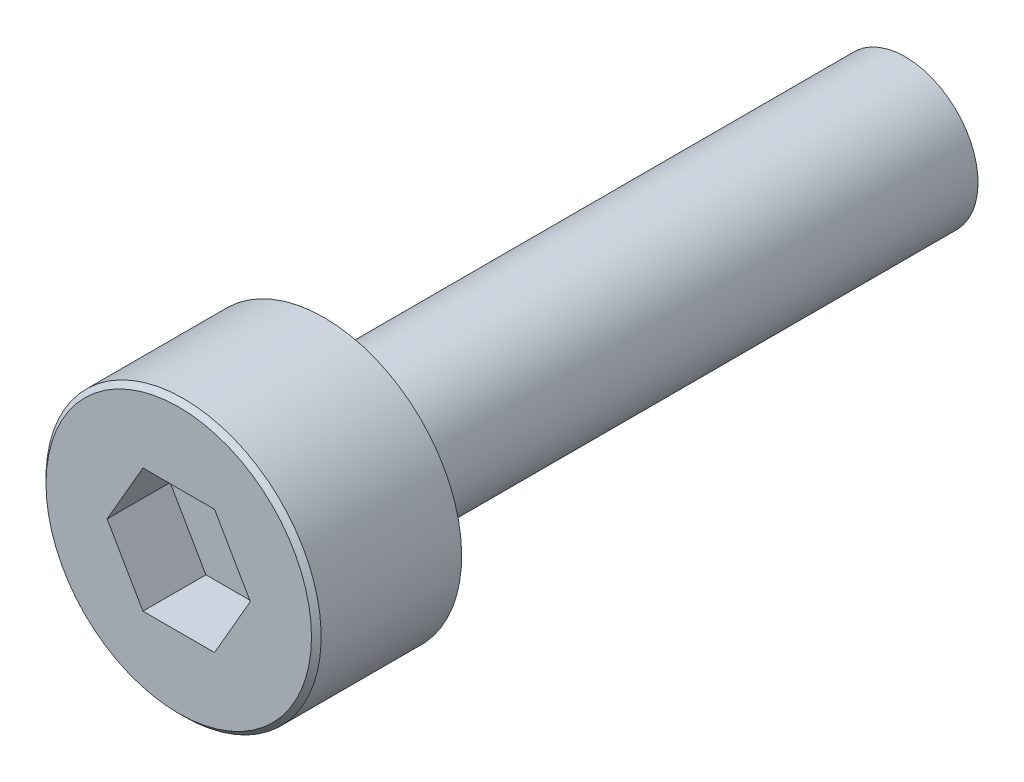
ISO-10303-21;
HEADER;
FILE_DESCRIPTION(('STEP AP214'),'2;1');
FILE_NAME('part.step','',(''),(''),'','','');
FILE_SCHEMA(('AUTOMOTIVE_DESIGN { 1 0 10303 214 1 1 1 1 }'));
ENDSEC;
DATA;
#1=APPLICATION_CONTEXT('core data for automotive mechanical design processes');
#2=APPLICATION_PROTOCOL_DEFINITION('international standard','automotive_design',2000,#1);
#3=PRODUCT_CONTEXT('',#1,'mechanical');
#4=PRODUCT('Part','Part','',(#3));
#5=PRODUCT_RELATED_PRODUCT_CATEGORY('part','',(#4));
#6=PRODUCT_DEFINITION_FORMATION('','',#4);
#7=PRODUCT_DEFINITION_CONTEXT('part definition',#1,'design');
#8=PRODUCT_DEFINITION('design','',#6,#7);
#9=PRODUCT_DEFINITION_SHAPE('','',#8);
#10=(LENGTH_UNIT() NAMED_UNIT(*) SI_UNIT(.MILLI.,.METRE.));
#11=(NAMED_UNIT(*) PLANE_ANGLE_UNIT() SI_UNIT($,.RADIAN.));
#12=(NAMED_UNIT(*) SI_UNIT($,.STERADIAN.) SOLID_ANGLE_UNIT());
#13=UNCERTAINTY_MEASURE_WITH_UNIT(LENGTH_MEASURE(1.E-05),#10,'distance_accuracy_value','');
#14=(GEOMETRIC_REPRESENTATION_CONTEXT(3) GLOBAL_UNCERTAINTY_ASSIGNED_CONTEXT((#13)) GLOBAL_UNIT_ASSIGNED_CONTEXT((#10,
#11,#12)) REPRESENTATION_CONTEXT('',''));
#15=CARTESIAN_POINT('',(0.,0.,0.));
#16=DIRECTION('',(0.,0.,1.));
#17=DIRECTION('',(1.,0.,0.));
#18=AXIS2_PLACEMENT_3D('',#15,#16,#17);
#19=CARTESIAN_POINT('',(0.,0.,0.));
#20=DIRECTION('',(0.,0.,1.));
#21=DIRECTION('',(0.,-1.,0.));
#22=AXIS2_PLACEMENT_3D('',#19,#20,#21);
#23=PLANE('',#22);
#24=CARTESIAN_POINT('',(0.,0.,0.));
#25=DIRECTION('',(0.,0.,1.));
#26=DIRECTION('',(0.,-1.,0.));
#27=AXIS2_PLACEMENT_3D('',#24,#25,#26);
#28=CIRCLE('',#27,2.73999999999999);
#29=CARTESIAN_POINT('',(0.,-2.73999999999999,0.));
#30=VERTEX_POINT('',#29);
#31=EDGE_CURVE('E11',#30,#30,#28,.T.);
#32=ORIENTED_EDGE('',*,*,#31,.T.);
#33=EDGE_LOOP('',(#32));
#34=FACE_BOUND('',#33,.T.);
#35=DIRECTION('',(-0.5,0.866025403784439,0.));
#36=VECTOR('',#35,1.);
#37=CARTESIAN_POINT('',(1.47801668912544,0.,0.));
#38=LINE('',#37,#36);
#39=CARTESIAN_POINT('',(1.47801668912544,0.,0.));
#40=VERTEX_POINT('',#39);
#41=CARTESIAN_POINT('',(0.739008344562721,1.28,0.));
#42=VERTEX_POINT('',#41);
#43=EDGE_CURVE('E56',#40,#42,#38,.T.);
#44=ORIENTED_EDGE('',*,*,#43,.F.);
#45=DIRECTION('',(0.5,0.866025403784439,0.));
#46=VECTOR('',#45,1.);
#47=CARTESIAN_POINT('',(0.739008344562721,-1.28,0.));
#48=LINE('',#47,#46);
#49=CARTESIAN_POINT('',(0.739008344562721,-1.28,0.));
#50=VERTEX_POINT('',#49);
#51=EDGE_CURVE('E139',#50,#40,#48,.T.);
#52=ORIENTED_EDGE('',*,*,#51,.F.);
#53=DIRECTION('',(1.,0.,0.));
#54=VECTOR('',#53,1.);
#55=CARTESIAN_POINT('',(-0.739008344562721,-1.28,0.));
#56=LINE('',#55,#54);
#57=CARTESIAN_POINT('',(-0.739008344562721,-1.28,0.));
#58=VERTEX_POINT('',#57);
#59=EDGE_CURVE('E137',#58,#50,#56,.T.);
#60=ORIENTED_EDGE('',*,*,#59,.F.);
#61=DIRECTION('',(0.5,-0.866025403784439,0.));
#62=VECTOR('',#61,1.);
#63=CARTESIAN_POINT('',(-1.47801668912544,0.,0.));
#64=LINE('',#63,#62);
#65=CARTESIAN_POINT('',(-1.47801668912544,0.,0.));
#66=VERTEX_POINT('',#65);
#67=EDGE_CURVE('E104',#66,#58,#64,.T.);
#68=ORIENTED_EDGE('',*,*,#67,.F.);
#69=DIRECTION('',(-0.5,-0.866025403784439,0.));
#70=VECTOR('',#69,1.);
#71=CARTESIAN_POINT('',(-0.739008344562721,1.28,0.));
#72=LINE('',#71,#70);
#73=CARTESIAN_POINT('',(-0.739008344562721,1.28,0.));
#74=VERTEX_POINT('',#73);
#75=EDGE_CURVE('E133',#74,#66,#72,.T.);
#76=ORIENTED_EDGE('',*,*,#75,.F.);
#77=DIRECTION('',(-1.,0.,0.));
#78=VECTOR('',#77,1.);
#79=CARTESIAN_POINT('',(0.739008344562721,1.28,0.));
#80=LINE('',#79,#78);
#81=EDGE_CURVE('E130',#42,#74,#80,.T.);
#82=ORIENTED_EDGE('',*,*,#81,.F.);
#83=EDGE_LOOP('',(#44,#52,#60,#68,#76,#82));
#84=FACE_BOUND('',#83,.T.);
#85=ADVANCED_FACE('F40',(#34,#84),#23,.T.);
#86=CARTESIAN_POINT('',(0.,0.,-15.));
#87=DIRECTION('',(0.,0.,-1.));
#88=DIRECTION('',(0.,1.,0.));
#89=AXIS2_PLACEMENT_3D('',#86,#87,#88);
#90=CYLINDRICAL_SURFACE('',#89,2.83999999999999);
#91=CARTESIAN_POINT('',(0.,0.,-0.100000000000001));
#92=DIRECTION('',(0.,0.,1.));
#93=DIRECTION('',(0.,-1.,0.));
#94=AXIS2_PLACEMENT_3D('',#91,#92,#93);
#95=CIRCLE('',#94,2.83999999999999);
#96=CARTESIAN_POINT('',(0.,-2.83999999999999,-0.100000000000001));
#97=VERTEX_POINT('',#96);
#98=EDGE_CURVE('E49',#97,#97,#95,.F.);
#99=ORIENTED_EDGE('',*,*,#98,.T.);
#100=EDGE_LOOP('',(#99));
#101=FACE_BOUND('',#100,.T.);
#102=CARTESIAN_POINT('',(0.,0.,-3.));
#103=DIRECTION('',(0.,0.,-1.));
#104=DIRECTION('',(0.,1.,0.));
#105=AXIS2_PLACEMENT_3D('',#102,#103,#104);
#106=CIRCLE('',#105,2.83999999999999);
#107=CARTESIAN_POINT('',(0.,2.83999999999999,-3.));
#108=VERTEX_POINT('',#107);
#109=EDGE_CURVE('E154',#108,#108,#106,.T.);
#110=ORIENTED_EDGE('',*,*,#109,.F.);
#111=EDGE_LOOP('',(#110));
#112=FACE_BOUND('',#111,.T.);
#113=ADVANCED_FACE('F159',(#101,#112),#90,.T.);
#114=CARTESIAN_POINT('',(0.,2.83999999999999,-3.));
#115=DIRECTION('',(0.,0.,-1.));
#116=DIRECTION('',(0.,1.,0.));
#117=AXIS2_PLACEMENT_3D('',#114,#115,#116);
#118=PLANE('',#117);
#119=ORIENTED_EDGE('',*,*,#109,.T.);
#120=EDGE_LOOP('',(#119));
#121=FACE_BOUND('',#120,.T.);
#122=CARTESIAN_POINT('',(0.,0.,-3.));
#123=DIRECTION('',(0.,0.,-1.));
#124=DIRECTION('',(0.,1.,0.));
#125=AXIS2_PLACEMENT_3D('',#122,#123,#124);
#126=CIRCLE('',#125,1.5);
#127=CARTESIAN_POINT('',(0.,1.5,-3.));
#128=VERTEX_POINT('',#127);
#129=EDGE_CURVE('E151',#128,#128,#126,.T.);
#130=ORIENTED_EDGE('',*,*,#129,.F.);
#131=EDGE_LOOP('',(#130));
#132=FACE_BOUND('',#131,.T.);
#133=ADVANCED_FACE('F175',(#121,#132),#118,.T.);
#134=CARTESIAN_POINT('',(0.,0.,-15.));
#135=DIRECTION('',(0.,0.,-1.));
#136=DIRECTION('',(0.,1.,0.));
#137=AXIS2_PLACEMENT_3D('',#134,#135,#136);
#138=CYLINDRICAL_SURFACE('',#137,1.5);
#139=ORIENTED_EDGE('',*,*,#129,.T.);
#140=EDGE_LOOP('',(#139));
#141=FACE_BOUND('',#140,.T.);
#142=CARTESIAN_POINT('',(0.,0.,-15.));
#143=DIRECTION('',(0.,0.,-1.));
#144=DIRECTION('',(0.,1.,0.));
#145=AXIS2_PLACEMENT_3D('',#142,#143,#144);
#146=CIRCLE('',#145,1.5);
#147=CARTESIAN_POINT('',(0.,1.5,-15.));
#148=VERTEX_POINT('',#147);
#149=EDGE_CURVE('E143',#148,#148,#146,.T.);
#150=ORIENTED_EDGE('',*,*,#149,.F.);
#151=EDGE_LOOP('',(#150));
#152=FACE_BOUND('',#151,.T.);
#153=ADVANCED_FACE('F181',(#141,#152),#138,.T.);
#154=CARTESIAN_POINT('',(0.,1.5,-15.));
#155=DIRECTION('',(0.,0.,-1.));
#156=DIRECTION('',(0.,1.,0.));
#157=AXIS2_PLACEMENT_3D('',#154,#155,#156);
#158=PLANE('',#157);
#159=ORIENTED_EDGE('',*,*,#149,.T.);
#160=EDGE_LOOP('',(#159));
#161=FACE_BOUND('',#160,.T.);
#162=ADVANCED_FACE('F185',(#161),#158,.T.);
#163=CARTESIAN_POINT('',(1.47801668912544,0.,-1.3));
#164=DIRECTION('',(0.866025403784439,0.5,0.));
#165=DIRECTION('',(-0.5,0.866025403784439,0.));
#166=AXIS2_PLACEMENT_3D('',#163,#164,#165);
#167=PLANE('',#166);
#168=ORIENTED_EDGE('',*,*,#43,.T.);
#169=DIRECTION('',(0.,0.,1.));
#170=VECTOR('',#169,1.);
#171=CARTESIAN_POINT('',(0.739008344562721,1.28,-1.3));
#172=LINE('',#171,#170);
#173=CARTESIAN_POINT('',(0.739008344562721,1.28,-1.3));
#174=VERTEX_POINT('',#173);
#175=EDGE_CURVE('E86',#174,#42,#172,.T.);
#176=ORIENTED_EDGE('',*,*,#175,.F.);
#177=DIRECTION('',(-0.5,0.866025403784439,0.));
#178=VECTOR('',#177,1.);
#179=CARTESIAN_POINT('',(1.47801668912544,0.,-1.3));
#180=LINE('',#179,#178);
#181=CARTESIAN_POINT('',(1.47801668912544,0.,-1.3));
#182=VERTEX_POINT('',#181);
#183=EDGE_CURVE('E141',#182,#174,#180,.T.);
#184=ORIENTED_EDGE('',*,*,#183,.F.);
#185=DIRECTION('',(0.,0.,1.));
#186=VECTOR('',#185,1.);
#187=CARTESIAN_POINT('',(1.47801668912544,0.,-1.3));
#188=LINE('',#187,#186);
#189=EDGE_CURVE('E64',#182,#40,#188,.T.);
#190=ORIENTED_EDGE('',*,*,#189,.T.);
#191=EDGE_LOOP('',(#168,#176,#184,#190));
#192=FACE_BOUND('',#191,.T.);
#193=ADVANCED_FACE('F189',(#192),#167,.F.);
#194=CARTESIAN_POINT('',(0.739008344562721,-1.28,-1.3));
#195=DIRECTION('',(0.866025403784439,-0.5,0.));
#196=DIRECTION('',(0.5,0.866025403784439,0.));
#197=AXIS2_PLACEMENT_3D('',#194,#195,#196);
#198=PLANE('',#197);
#199=ORIENTED_EDGE('',*,*,#51,.T.);
#200=ORIENTED_EDGE('',*,*,#189,.F.);
#201=DIRECTION('',(0.5,0.866025403784439,0.));
#202=VECTOR('',#201,1.);
#203=CARTESIAN_POINT('',(0.739008344562721,-1.28,-1.3));
#204=LINE('',#203,#202);
#205=CARTESIAN_POINT('',(0.739008344562721,-1.28,-1.3));
#206=VERTEX_POINT('',#205);
#207=EDGE_CURVE('E116',#206,#182,#204,.T.);
#208=ORIENTED_EDGE('',*,*,#207,.F.);
#209=DIRECTION('',(0.,0.,1.));
#210=VECTOR('',#209,1.);
#211=CARTESIAN_POINT('',(0.739008344562721,-1.28,-1.3));
#212=LINE('',#211,#210);
#213=EDGE_CURVE('E108',#206,#50,#212,.T.);
#214=ORIENTED_EDGE('',*,*,#213,.T.);
#215=EDGE_LOOP('',(#199,#200,#208,#214));
#216=FACE_BOUND('',#215,.T.);
#217=ADVANCED_FACE('F193',(#216),#198,.F.);
#218=CARTESIAN_POINT('',(-0.739008344562721,-1.28,-1.3));
#219=DIRECTION('',(0.,-1.,0.));
#220=DIRECTION('',(0.,0.,-1.));
#221=AXIS2_PLACEMENT_3D('',#218,#219,#220);
#222=PLANE('',#221);
#223=ORIENTED_EDGE('',*,*,#59,.T.);
#224=ORIENTED_EDGE('',*,*,#213,.F.);
#225=DIRECTION('',(1.,0.,0.));
#226=VECTOR('',#225,1.);
#227=CARTESIAN_POINT('',(-0.739008344562721,-1.28,-1.3));
#228=LINE('',#227,#226);
#229=CARTESIAN_POINT('',(-0.739008344562721,-1.28,-1.3));
#230=VERTEX_POINT('',#229);
#231=EDGE_CURVE('E112',#230,#206,#228,.T.);
#232=ORIENTED_EDGE('',*,*,#231,.F.);
#233=DIRECTION('',(0.,0.,1.));
#234=VECTOR('',#233,1.);
#235=CARTESIAN_POINT('',(-0.739008344562721,-1.28,-1.3));
#236=LINE('',#235,#234);
#237=EDGE_CURVE('E97',#230,#58,#236,.T.);
#238=ORIENTED_EDGE('',*,*,#237,.T.);
#239=EDGE_LOOP('',(#223,#224,#232,#238));
#240=FACE_BOUND('',#239,.T.);
#241=ADVANCED_FACE('F113',(#240),#222,.F.);
#242=CARTESIAN_POINT('',(-1.47801668912544,0.,-1.3));
#243=DIRECTION('',(-0.866025403784439,-0.5,0.));
#244=DIRECTION('',(0.5,-0.866025403784439,0.));
#245=AXIS2_PLACEMENT_3D('',#242,#243,#244);
#246=PLANE('',#245);
#247=ORIENTED_EDGE('',*,*,#67,.T.);
#248=ORIENTED_EDGE('',*,*,#237,.F.);
#249=DIRECTION('',(0.5,-0.866025403784439,0.));
#250=VECTOR('',#249,1.);
#251=CARTESIAN_POINT('',(-1.47801668912544,0.,-1.3));
#252=LINE('',#251,#250);
#253=CARTESIAN_POINT('',(-1.47801668912544,0.,-1.3));
#254=VERTEX_POINT('',#253);
#255=EDGE_CURVE('E101',#254,#230,#252,.T.);
#256=ORIENTED_EDGE('',*,*,#255,.F.);
#257=DIRECTION('',(0.,0.,1.));
#258=VECTOR('',#257,1.);
#259=CARTESIAN_POINT('',(-1.47801668912544,0.,-1.3));
#260=LINE('',#259,#258);
#261=EDGE_CURVE('E109',#254,#66,#260,.T.);
#262=ORIENTED_EDGE('',*,*,#261,.T.);
#263=EDGE_LOOP('',(#247,#248,#256,#262));
#264=FACE_BOUND('',#263,.T.);
#265=ADVANCED_FACE('F99',(#264),#246,.F.);
#266=CARTESIAN_POINT('',(-0.739008344562721,1.28,-1.3));
#267=DIRECTION('',(-0.866025403784439,0.5,0.));
#268=DIRECTION('',(-0.5,-0.866025403784439,0.));
#269=AXIS2_PLACEMENT_3D('',#266,#267,#268);
#270=PLANE('',#269);
#271=ORIENTED_EDGE('',*,*,#75,.T.);
#272=ORIENTED_EDGE('',*,*,#261,.F.);
#273=DIRECTION('',(-0.5,-0.866025403784439,0.));
#274=VECTOR('',#273,1.);
#275=CARTESIAN_POINT('',(-0.739008344562721,1.28,-1.3));
#276=LINE('',#275,#274);
#277=CARTESIAN_POINT('',(-0.739008344562721,1.28,-1.3));
#278=VERTEX_POINT('',#277);
#279=EDGE_CURVE('E122',#278,#254,#276,.T.);
#280=ORIENTED_EDGE('',*,*,#279,.F.);
#281=DIRECTION('',(0.,0.,1.));
#282=VECTOR('',#281,1.);
#283=CARTESIAN_POINT('',(-0.739008344562721,1.28,-1.3));
#284=LINE('',#283,#282);
#285=EDGE_CURVE('E146',#278,#74,#284,.T.);
#286=ORIENTED_EDGE('',*,*,#285,.T.);
#287=EDGE_LOOP('',(#271,#272,#280,#286));
#288=FACE_BOUND('',#287,.T.);
#289=ADVANCED_FACE('F196',(#288),#270,.F.);
#290=CARTESIAN_POINT('',(0.739008344562721,1.28,-1.3));
#291=DIRECTION('',(0.,1.,0.));
#292=DIRECTION('',(0.,0.,1.));
#293=AXIS2_PLACEMENT_3D('',#290,#291,#292);
#294=PLANE('',#293);
#295=ORIENTED_EDGE('',*,*,#81,.T.);
#296=ORIENTED_EDGE('',*,*,#285,.F.);
#297=DIRECTION('',(-1.,0.,0.));
#298=VECTOR('',#297,1.);
#299=CARTESIAN_POINT('',(0.739008344562721,1.28,-1.3));
#300=LINE('',#299,#298);
#301=EDGE_CURVE('E124',#174,#278,#300,.T.);
#302=ORIENTED_EDGE('',*,*,#301,.F.);
#303=ORIENTED_EDGE('',*,*,#175,.T.);
#304=EDGE_LOOP('',(#295,#296,#302,#303));
#305=FACE_BOUND('',#304,.T.);
#306=ADVANCED_FACE('F167',(#305),#294,.F.);
#307=CARTESIAN_POINT('',(0.,0.,-1.3));
#308=DIRECTION('',(0.,0.,1.));
#309=DIRECTION('',(1.,0.,0.));
#310=AXIS2_PLACEMENT_3D('',#307,#308,#309);
#311=PLANE('',#310);
#312=ORIENTED_EDGE('',*,*,#183,.T.);
#313=ORIENTED_EDGE('',*,*,#301,.T.);
#314=ORIENTED_EDGE('',*,*,#279,.T.);
#315=ORIENTED_EDGE('',*,*,#255,.T.);
#316=ORIENTED_EDGE('',*,*,#231,.T.);
#317=ORIENTED_EDGE('',*,*,#207,.T.);
#318=EDGE_LOOP('',(#312,#313,#314,#315,#316,#317));
#319=FACE_BOUND('',#318,.T.);
#320=ADVANCED_FACE('F119',(#319),#311,.T.);
#321=CARTESIAN_POINT('',(0.,0.,-0.100000000000001));
#322=DIRECTION('',(0.,0.,-1.));
#323=DIRECTION('',(0.,1.,0.));
#324=AXIS2_PLACEMENT_3D('',#321,#322,#323);
#325=CONICAL_SURFACE('',#324,2.83999999999999,0.785398163397446);
#326=ORIENTED_EDGE('',*,*,#31,.F.);
#327=EDGE_LOOP('',(#326));
#328=FACE_BOUND('',#327,.T.);
#329=ORIENTED_EDGE('',*,*,#98,.F.);
#330=EDGE_LOOP('',(#329));
#331=FACE_BOUND('',#330,.T.);
#332=ADVANCED_FACE('F43',(#328,#331),#325,.T.);
#333=CLOSED_SHELL('',(#85,#113,#133,#153,#162,#193,#217,#241,#265,#289,#306,#320,#332));
#334=MANIFOLD_SOLID_BREP('B2',#333);
#335=ADVANCED_BREP_SHAPE_REPRESENTATION('',(#18,#334),#14);
#336=SHAPE_DEFINITION_REPRESENTATION(#9,#335);
ENDSEC;
END-ISO-10303-21;
